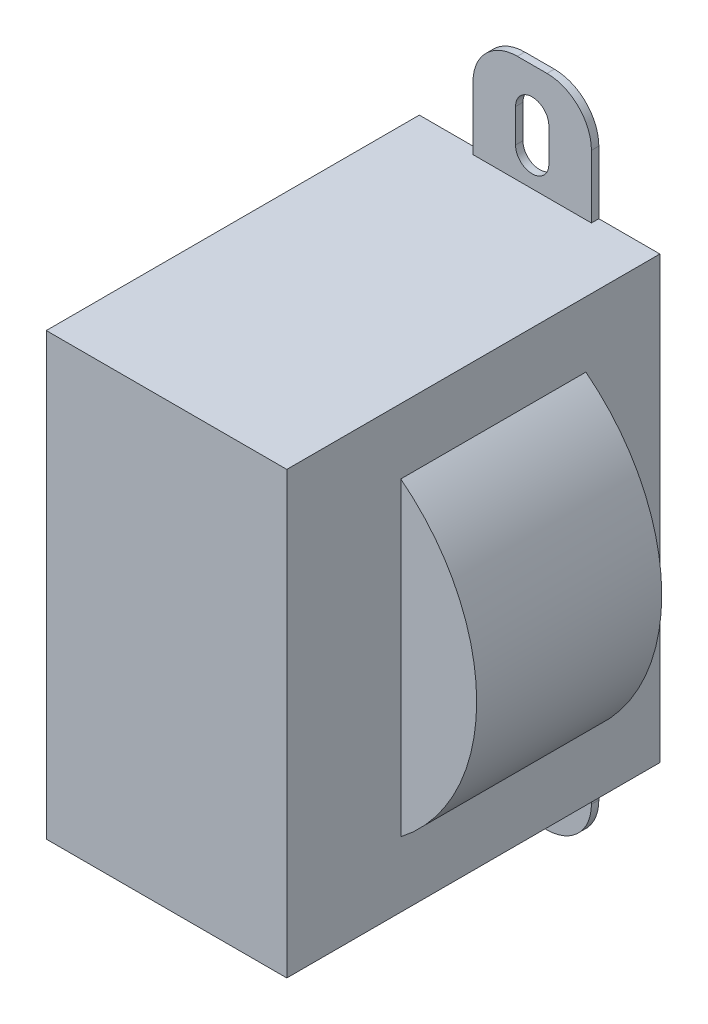
ISO-10303-21;
HEADER;
FILE_DESCRIPTION(('STEP AP214'),'2;1');
FILE_NAME('part.step','',(''),(''),'','','');
FILE_SCHEMA(('AUTOMOTIVE_DESIGN { 1 0 10303 214 1 1 1 1 }'));
ENDSEC;
DATA;
#1=APPLICATION_CONTEXT('core data for automotive mechanical design processes');
#2=APPLICATION_PROTOCOL_DEFINITION('international standard','automotive_design',2000,#1);
#3=PRODUCT_CONTEXT('',#1,'mechanical');
#4=PRODUCT('Part','Part','',(#3));
#5=PRODUCT_RELATED_PRODUCT_CATEGORY('part','',(#4));
#6=PRODUCT_DEFINITION_FORMATION('','',#4);
#7=PRODUCT_DEFINITION_CONTEXT('part definition',#1,'design');
#8=PRODUCT_DEFINITION('design','',#6,#7);
#9=PRODUCT_DEFINITION_SHAPE('','',#8);
#10=(LENGTH_UNIT() NAMED_UNIT(*) SI_UNIT(.MILLI.,.METRE.));
#11=(NAMED_UNIT(*) PLANE_ANGLE_UNIT() SI_UNIT($,.RADIAN.));
#12=(NAMED_UNIT(*) SI_UNIT($,.STERADIAN.) SOLID_ANGLE_UNIT());
#13=UNCERTAINTY_MEASURE_WITH_UNIT(LENGTH_MEASURE(1.E-05),#10,'distance_accuracy_value','');
#14=(GEOMETRIC_REPRESENTATION_CONTEXT(3) GLOBAL_UNCERTAINTY_ASSIGNED_CONTEXT((#13)) GLOBAL_UNIT_ASSIGNED_CONTEXT((#10,
#11,#12)) REPRESENTATION_CONTEXT('',''));
#15=CARTESIAN_POINT('',(0.,0.,0.));
#16=DIRECTION('',(0.,0.,1.));
#17=DIRECTION('',(1.,0.,0.));
#18=AXIS2_PLACEMENT_3D('',#15,#16,#17);
#19=CARTESIAN_POINT('',(-16.25,-29.75,42.4));
#20=DIRECTION('',(0.,1.,0.));
#21=DIRECTION('',(-1.,0.,0.));
#22=AXIS2_PLACEMENT_3D('',#19,#20,#21);
#23=PLANE('',#22);
#24=DIRECTION('',(0.,0.,-1.));
#25=VECTOR('',#24,1.);
#26=CARTESIAN_POINT('',(-7.99999999999999,-29.75,1.));
#27=LINE('',#26,#25);
#28=CARTESIAN_POINT('',(-7.99999999999999,-29.75,1.));
#29=VERTEX_POINT('',#28);
#30=CARTESIAN_POINT('',(-7.99999999999999,-29.75,0.));
#31=VERTEX_POINT('',#30);
#32=EDGE_CURVE('E325',#29,#31,#27,.T.);
#33=ORIENTED_EDGE('',*,*,#32,.F.);
#34=DIRECTION('',(-1.,0.,0.));
#35=VECTOR('',#34,1.);
#36=CARTESIAN_POINT('',(-7.99999999999999,-29.75,1.));
#37=LINE('',#36,#35);
#38=CARTESIAN_POINT('',(7.99999999999999,-29.75,1.));
#39=VERTEX_POINT('',#38);
#40=EDGE_CURVE('E308',#39,#29,#37,.T.);
#41=ORIENTED_EDGE('',*,*,#40,.F.);
#42=DIRECTION('',(0.,0.,-1.));
#43=VECTOR('',#42,1.);
#44=CARTESIAN_POINT('',(7.99999999999999,-29.75,1.));
#45=LINE('',#44,#43);
#46=CARTESIAN_POINT('',(8.,-29.75,0.));
#47=VERTEX_POINT('',#46);
#48=EDGE_CURVE('E331',#39,#47,#45,.T.);
#49=ORIENTED_EDGE('',*,*,#48,.T.);
#50=DIRECTION('',(1.,0.,0.));
#51=VECTOR('',#50,1.);
#52=CARTESIAN_POINT('',(-16.25,-29.75,0.));
#53=LINE('',#52,#51);
#54=CARTESIAN_POINT('',(16.25,-29.75,0.));
#55=VERTEX_POINT('',#54);
#56=EDGE_CURVE('E334',#47,#55,#53,.T.);
#57=ORIENTED_EDGE('',*,*,#56,.T.);
#58=DIRECTION('',(0.,0.,-1.));
#59=VECTOR('',#58,1.);
#60=CARTESIAN_POINT('',(16.25,-29.75,42.4));
#61=LINE('',#60,#59);
#62=CARTESIAN_POINT('',(16.25,-29.7500000000001,50.4));
#63=VERTEX_POINT('',#62);
#64=EDGE_CURVE('E357',#63,#55,#61,.T.);
#65=ORIENTED_EDGE('',*,*,#64,.F.);
#66=DIRECTION('',(1.,0.,0.));
#67=VECTOR('',#66,1.);
#68=CARTESIAN_POINT('',(16.25,-29.7500000000001,50.4));
#69=LINE('',#68,#67);
#70=CARTESIAN_POINT('',(-16.2432430182236,-29.75,50.4));
#71=VERTEX_POINT('',#70);
#72=EDGE_CURVE('E248',#71,#63,#69,.T.);
#73=ORIENTED_EDGE('',*,*,#72,.F.);
#74=DIRECTION('',(0.,0.,-1.));
#75=VECTOR('',#74,1.);
#76=CARTESIAN_POINT('',(-16.2432430182236,-29.75,50.4));
#77=LINE('',#76,#75);
#78=CARTESIAN_POINT('',(-16.2432430182236,-29.75,42.4));
#79=VERTEX_POINT('',#78);
#80=EDGE_CURVE('E240',#71,#79,#77,.T.);
#81=ORIENTED_EDGE('',*,*,#80,.T.);
#82=DIRECTION('',(1.,0.,0.));
#83=VECTOR('',#82,1.);
#84=CARTESIAN_POINT('',(-16.25,-29.75,42.4));
#85=LINE('',#84,#83);
#86=CARTESIAN_POINT('',(-16.25,-29.75,42.4));
#87=VERTEX_POINT('',#86);
#88=EDGE_CURVE('E225',#87,#79,#85,.T.);
#89=ORIENTED_EDGE('',*,*,#88,.F.);
#90=DIRECTION('',(0.,0.,-1.));
#91=VECTOR('',#90,1.);
#92=CARTESIAN_POINT('',(-16.25,-29.75,42.4));
#93=LINE('',#92,#91);
#94=CARTESIAN_POINT('',(-16.25,-29.75,0.));
#95=VERTEX_POINT('',#94);
#96=EDGE_CURVE('E360',#87,#95,#93,.T.);
#97=ORIENTED_EDGE('',*,*,#96,.T.);
#98=EDGE_CURVE('E373',#95,#31,#53,.T.);
#99=ORIENTED_EDGE('',*,*,#98,.T.);
#100=EDGE_LOOP('',(#33,#41,#49,#57,#65,#73,#81,#89,#97,#99));
#101=FACE_BOUND('',#100,.T.);
#102=ADVANCED_FACE('F28',(#101),#23,.F.);
#103=CARTESIAN_POINT('',(-16.25,29.75,42.4));
#104=DIRECTION('',(0.,-1.,0.));
#105=DIRECTION('',(1.,0.,0.));
#106=AXIS2_PLACEMENT_3D('',#103,#104,#105);
#107=PLANE('',#106);
#108=DIRECTION('',(0.,0.,-1.));
#109=VECTOR('',#108,1.);
#110=CARTESIAN_POINT('',(7.99999999999999,29.75,1.));
#111=LINE('',#110,#109);
#112=CARTESIAN_POINT('',(7.99999999999999,29.75,1.));
#113=VERTEX_POINT('',#112);
#114=CARTESIAN_POINT('',(7.99999999999999,29.75,0.));
#115=VERTEX_POINT('',#114);
#116=EDGE_CURVE('E390',#113,#115,#111,.T.);
#117=ORIENTED_EDGE('',*,*,#116,.F.);
#118=DIRECTION('',(1.,0.,0.));
#119=VECTOR('',#118,1.);
#120=CARTESIAN_POINT('',(-7.99999999999999,29.75,1.));
#121=LINE('',#120,#119);
#122=CARTESIAN_POINT('',(-7.99999999999999,29.75,1.));
#123=VERTEX_POINT('',#122);
#124=EDGE_CURVE('E393',#123,#113,#121,.T.);
#125=ORIENTED_EDGE('',*,*,#124,.F.);
#126=DIRECTION('',(0.,0.,-1.));
#127=VECTOR('',#126,1.);
#128=CARTESIAN_POINT('',(-7.99999999999999,29.75,1.));
#129=LINE('',#128,#127);
#130=CARTESIAN_POINT('',(-7.99999999999999,29.75,0.));
#131=VERTEX_POINT('',#130);
#132=EDGE_CURVE('E392',#123,#131,#129,.T.);
#133=ORIENTED_EDGE('',*,*,#132,.T.);
#134=DIRECTION('',(-1.,0.,0.));
#135=VECTOR('',#134,1.);
#136=CARTESIAN_POINT('',(-16.25,29.75,0.));
#137=LINE('',#136,#135);
#138=CARTESIAN_POINT('',(-16.25,29.75,0.));
#139=VERTEX_POINT('',#138);
#140=EDGE_CURVE('E367',#131,#139,#137,.T.);
#141=ORIENTED_EDGE('',*,*,#140,.T.);
#142=DIRECTION('',(0.,0.,-1.));
#143=VECTOR('',#142,1.);
#144=CARTESIAN_POINT('',(-16.25,29.75,42.4));
#145=LINE('',#144,#143);
#146=CARTESIAN_POINT('',(-16.25,29.75,42.4));
#147=VERTEX_POINT('',#146);
#148=EDGE_CURVE('E351',#147,#139,#145,.T.);
#149=ORIENTED_EDGE('',*,*,#148,.F.);
#150=DIRECTION('',(-1.,0.,0.));
#151=VECTOR('',#150,1.);
#152=CARTESIAN_POINT('',(-16.25,29.75,42.4));
#153=LINE('',#152,#151);
#154=CARTESIAN_POINT('',(-16.2432430182236,29.75,42.4));
#155=VERTEX_POINT('',#154);
#156=EDGE_CURVE('E233',#155,#147,#153,.T.);
#157=ORIENTED_EDGE('',*,*,#156,.F.);
#158=DIRECTION('',(0.,0.,-1.));
#159=VECTOR('',#158,1.);
#160=CARTESIAN_POINT('',(-16.2432430182236,29.7500000000001,50.4));
#161=LINE('',#160,#159);
#162=CARTESIAN_POINT('',(-16.2432430182236,29.7500000000001,50.4));
#163=VERTEX_POINT('',#162);
#164=EDGE_CURVE('E243',#163,#155,#161,.T.);
#165=ORIENTED_EDGE('',*,*,#164,.F.);
#166=DIRECTION('',(-1.,0.,0.));
#167=VECTOR('',#166,1.);
#168=CARTESIAN_POINT('',(16.25,29.7500000000001,50.4));
#169=LINE('',#168,#167);
#170=CARTESIAN_POINT('',(16.25,29.7500000000001,50.4));
#171=VERTEX_POINT('',#170);
#172=EDGE_CURVE('E262',#171,#163,#169,.T.);
#173=ORIENTED_EDGE('',*,*,#172,.F.);
#174=DIRECTION('',(0.,0.,-1.));
#175=VECTOR('',#174,1.);
#176=CARTESIAN_POINT('',(16.25,29.75,42.4));
#177=LINE('',#176,#175);
#178=CARTESIAN_POINT('',(16.25,29.75,0.));
#179=VERTEX_POINT('',#178);
#180=EDGE_CURVE('E354',#171,#179,#177,.T.);
#181=ORIENTED_EDGE('',*,*,#180,.T.);
#182=EDGE_CURVE('E364',#179,#115,#137,.T.);
#183=ORIENTED_EDGE('',*,*,#182,.T.);
#184=EDGE_LOOP('',(#117,#125,#133,#141,#149,#157,#165,#173,#181,#183));
#185=FACE_BOUND('',#184,.T.);
#186=ADVANCED_FACE('F460',(#185),#107,.F.);
#187=CARTESIAN_POINT('',(-16.25,29.75,42.4));
#188=DIRECTION('',(1.,0.,0.));
#189=DIRECTION('',(0.,1.,0.));
#190=AXIS2_PLACEMENT_3D('',#187,#188,#189);
#191=PLANE('',#190);
#192=DIRECTION('',(0.,0.,-1.));
#193=VECTOR('',#192,1.);
#194=CARTESIAN_POINT('',(-16.25,20.9329286054293,35.));
#195=LINE('',#194,#193);
#196=CARTESIAN_POINT('',(-16.25,20.9329286054293,35.));
#197=VERTEX_POINT('',#196);
#198=CARTESIAN_POINT('',(-16.25,20.9329286054293,10.));
#199=VERTEX_POINT('',#198);
#200=EDGE_CURVE('E429',#197,#199,#195,.T.);
#201=ORIENTED_EDGE('',*,*,#200,.F.);
#202=DIRECTION('',(0.,-1.,0.));
#203=VECTOR('',#202,1.);
#204=CARTESIAN_POINT('',(-16.25,29.75,35.));
#205=LINE('',#204,#203);
#206=CARTESIAN_POINT('',(-16.25,-20.9329286054293,35.));
#207=VERTEX_POINT('',#206);
#208=EDGE_CURVE('E441',#197,#207,#205,.T.);
#209=ORIENTED_EDGE('',*,*,#208,.T.);
#210=DIRECTION('',(0.,0.,-1.));
#211=VECTOR('',#210,1.);
#212=CARTESIAN_POINT('',(-16.25,-20.9329286054293,35.));
#213=LINE('',#212,#211);
#214=CARTESIAN_POINT('',(-16.25,-20.9329286054293,10.));
#215=VERTEX_POINT('',#214);
#216=EDGE_CURVE('E437',#207,#215,#213,.T.);
#217=ORIENTED_EDGE('',*,*,#216,.T.);
#218=DIRECTION('',(0.,-1.,0.));
#219=VECTOR('',#218,1.);
#220=CARTESIAN_POINT('',(-16.25,29.75,10.));
#221=LINE('',#220,#219);
#222=EDGE_CURVE('E439',#199,#215,#221,.T.);
#223=ORIENTED_EDGE('',*,*,#222,.F.);
#224=EDGE_LOOP('',(#201,#209,#217,#223));
#225=FACE_BOUND('',#224,.T.);
#226=DIRECTION('',(0.,-1.,0.));
#227=VECTOR('',#226,1.);
#228=CARTESIAN_POINT('',(-16.25,29.75,0.));
#229=LINE('',#228,#227);
#230=EDGE_CURVE('E376',#139,#95,#229,.T.);
#231=ORIENTED_EDGE('',*,*,#230,.T.);
#232=ORIENTED_EDGE('',*,*,#96,.F.);
#233=DIRECTION('',(0.,-1.,0.));
#234=VECTOR('',#233,1.);
#235=CARTESIAN_POINT('',(-16.25,29.75,42.4));
#236=LINE('',#235,#234);
#237=EDGE_CURVE('E228',#147,#87,#236,.T.);
#238=ORIENTED_EDGE('',*,*,#237,.F.);
#239=ORIENTED_EDGE('',*,*,#148,.T.);
#240=EDGE_LOOP('',(#231,#232,#238,#239));
#241=FACE_BOUND('',#240,.T.);
#242=ADVANCED_FACE('F30',(#225,#241),#191,.F.);
#243=CARTESIAN_POINT('',(16.25,29.75,42.4));
#244=DIRECTION('',(-1.,0.,0.));
#245=DIRECTION('',(0.,-1.,0.));
#246=AXIS2_PLACEMENT_3D('',#243,#244,#245);
#247=PLANE('',#246);
#248=DIRECTION('',(0.,0.,-1.));
#249=VECTOR('',#248,1.);
#250=CARTESIAN_POINT('',(16.25,-20.9329286054293,35.));
#251=LINE('',#250,#249);
#252=CARTESIAN_POINT('',(16.25,-20.9329286054293,35.));
#253=VERTEX_POINT('',#252);
#254=CARTESIAN_POINT('',(16.25,-20.9329286054293,10.));
#255=VERTEX_POINT('',#254);
#256=EDGE_CURVE('E434',#253,#255,#251,.T.);
#257=ORIENTED_EDGE('',*,*,#256,.F.);
#258=DIRECTION('',(0.,1.,0.));
#259=VECTOR('',#258,1.);
#260=CARTESIAN_POINT('',(16.25,29.75,35.));
#261=LINE('',#260,#259);
#262=CARTESIAN_POINT('',(16.25,20.9329286054293,35.));
#263=VERTEX_POINT('',#262);
#264=EDGE_CURVE('E11',#253,#263,#261,.T.);
#265=ORIENTED_EDGE('',*,*,#264,.T.);
#266=DIRECTION('',(0.,0.,-1.));
#267=VECTOR('',#266,1.);
#268=CARTESIAN_POINT('',(16.25,20.9329286054293,35.));
#269=LINE('',#268,#267);
#270=CARTESIAN_POINT('',(16.25,20.9329286054293,10.));
#271=VERTEX_POINT('',#270);
#272=EDGE_CURVE('E432',#263,#271,#269,.T.);
#273=ORIENTED_EDGE('',*,*,#272,.T.);
#274=DIRECTION('',(0.,1.,0.));
#275=VECTOR('',#274,1.);
#276=CARTESIAN_POINT('',(16.25,29.75,10.));
#277=LINE('',#276,#275);
#278=EDGE_CURVE('E37',#255,#271,#277,.T.);
#279=ORIENTED_EDGE('',*,*,#278,.F.);
#280=EDGE_LOOP('',(#257,#265,#273,#279));
#281=FACE_BOUND('',#280,.T.);
#282=DIRECTION('',(0.,1.,0.));
#283=VECTOR('',#282,1.);
#284=CARTESIAN_POINT('',(16.25,29.75,0.));
#285=LINE('',#284,#283);
#286=EDGE_CURVE('E371',#55,#179,#285,.T.);
#287=ORIENTED_EDGE('',*,*,#286,.T.);
#288=ORIENTED_EDGE('',*,*,#180,.F.);
#289=DIRECTION('',(0.,1.,0.));
#290=VECTOR('',#289,1.);
#291=CARTESIAN_POINT('',(16.25,29.7500000000001,50.4));
#292=LINE('',#291,#290);
#293=EDGE_CURVE('E244',#63,#171,#292,.T.);
#294=ORIENTED_EDGE('',*,*,#293,.F.);
#295=ORIENTED_EDGE('',*,*,#64,.T.);
#296=EDGE_LOOP('',(#287,#288,#294,#295));
#297=FACE_BOUND('',#296,.T.);
#298=ADVANCED_FACE('F453',(#281,#297),#247,.F.);
#299=CARTESIAN_POINT('',(-16.25,-29.75,42.4));
#300=DIRECTION('',(0.,0.,1.));
#301=DIRECTION('',(1.,0.,0.));
#302=AXIS2_PLACEMENT_3D('',#299,#300,#301);
#303=PLANE('',#302);
#304=DIRECTION('',(0.,-1.,0.));
#305=VECTOR('',#304,1.);
#306=CARTESIAN_POINT('',(-16.2432430182236,29.7500000000001,42.4));
#307=LINE('',#306,#305);
#308=EDGE_CURVE('E45',#155,#79,#307,.T.);
#309=ORIENTED_EDGE('',*,*,#308,.F.);
#310=ORIENTED_EDGE('',*,*,#156,.T.);
#311=ORIENTED_EDGE('',*,*,#237,.T.);
#312=ORIENTED_EDGE('',*,*,#88,.T.);
#313=EDGE_LOOP('',(#309,#310,#311,#312));
#314=FACE_BOUND('',#313,.T.);
#315=ADVANCED_FACE('F226',(#314),#303,.T.);
#316=CARTESIAN_POINT('',(-16.25,-29.75,0.));
#317=DIRECTION('',(0.,0.,1.));
#318=DIRECTION('',(1.,0.,0.));
#319=AXIS2_PLACEMENT_3D('',#316,#317,#318);
#320=PLANE('',#319);
#321=ORIENTED_EDGE('',*,*,#230,.F.);
#322=ORIENTED_EDGE('',*,*,#140,.F.);
#323=DIRECTION('',(0.,-1.,0.));
#324=VECTOR('',#323,1.);
#325=CARTESIAN_POINT('',(-8.,38.25,0.));
#326=LINE('',#325,#324);
#327=CARTESIAN_POINT('',(-8.,38.25,0.));
#328=VERTEX_POINT('',#327);
#329=EDGE_CURVE('E396',#328,#131,#326,.T.);
#330=ORIENTED_EDGE('',*,*,#329,.F.);
#331=CARTESIAN_POINT('',(-2.,38.25,0.));
#332=DIRECTION('',(0.,0.,1.));
#333=DIRECTION('',(-1.,0.,0.));
#334=AXIS2_PLACEMENT_3D('',#331,#332,#333);
#335=CIRCLE('',#334,6.);
#336=CARTESIAN_POINT('',(-1.99999999999996,44.25,0.));
#337=VERTEX_POINT('',#336);
#338=EDGE_CURVE('E398',#337,#328,#335,.T.);
#339=ORIENTED_EDGE('',*,*,#338,.F.);
#340=DIRECTION('',(-1.,0.,0.));
#341=VECTOR('',#340,1.);
#342=CARTESIAN_POINT('',(-1.99999999999996,44.25,0.));
#343=LINE('',#342,#341);
#344=CARTESIAN_POINT('',(1.99999999999999,44.25,0.));
#345=VERTEX_POINT('',#344);
#346=EDGE_CURVE('E783',#345,#337,#343,.T.);
#347=ORIENTED_EDGE('',*,*,#346,.F.);
#348=CARTESIAN_POINT('',(1.99999999999999,38.25,0.));
#349=DIRECTION('',(0.,0.,1.));
#350=DIRECTION('',(1.,0.,0.));
#351=AXIS2_PLACEMENT_3D('',#348,#349,#350);
#352=CIRCLE('',#351,6.);
#353=CARTESIAN_POINT('',(7.99999999999999,38.25,0.));
#354=VERTEX_POINT('',#353);
#355=EDGE_CURVE('E386',#354,#345,#352,.T.);
#356=ORIENTED_EDGE('',*,*,#355,.F.);
#357=DIRECTION('',(0.,1.,0.));
#358=VECTOR('',#357,1.);
#359=CARTESIAN_POINT('',(8.,38.25,0.));
#360=LINE('',#359,#358);
#361=EDGE_CURVE('E383',#115,#354,#360,.T.);
#362=ORIENTED_EDGE('',*,*,#361,.F.);
#363=ORIENTED_EDGE('',*,*,#182,.F.);
#364=ORIENTED_EDGE('',*,*,#286,.F.);
#365=ORIENTED_EDGE('',*,*,#56,.F.);
#366=DIRECTION('',(0.,1.,0.));
#367=VECTOR('',#366,1.);
#368=CARTESIAN_POINT('',(8.,-38.25,0.));
#369=LINE('',#368,#367);
#370=CARTESIAN_POINT('',(8.,-38.25,0.));
#371=VERTEX_POINT('',#370);
#372=EDGE_CURVE('E53',#371,#47,#369,.T.);
#373=ORIENTED_EDGE('',*,*,#372,.F.);
#374=CARTESIAN_POINT('',(1.99999999999999,-38.25,0.));
#375=DIRECTION('',(0.,0.,1.));
#376=DIRECTION('',(-1.,0.,0.));
#377=AXIS2_PLACEMENT_3D('',#374,#375,#376);
#378=CIRCLE('',#377,6.);
#379=CARTESIAN_POINT('',(1.99999999999999,-44.25,0.));
#380=VERTEX_POINT('',#379);
#381=EDGE_CURVE('E295',#380,#371,#378,.T.);
#382=ORIENTED_EDGE('',*,*,#381,.F.);
#383=DIRECTION('',(1.,0.,0.));
#384=VECTOR('',#383,1.);
#385=CARTESIAN_POINT('',(-1.99999999999996,-44.25,0.));
#386=LINE('',#385,#384);
#387=CARTESIAN_POINT('',(-1.99999999999996,-44.25,0.));
#388=VERTEX_POINT('',#387);
#389=EDGE_CURVE('E300',#388,#380,#386,.T.);
#390=ORIENTED_EDGE('',*,*,#389,.F.);
#391=CARTESIAN_POINT('',(-2.,-38.25,0.));
#392=DIRECTION('',(0.,0.,1.));
#393=DIRECTION('',(1.,0.,0.));
#394=AXIS2_PLACEMENT_3D('',#391,#392,#393);
#395=CIRCLE('',#394,6.);
#396=CARTESIAN_POINT('',(-8.,-38.25,0.));
#397=VERTEX_POINT('',#396);
#398=EDGE_CURVE('E298',#397,#388,#395,.T.);
#399=ORIENTED_EDGE('',*,*,#398,.F.);
#400=DIRECTION('',(0.,-1.,0.));
#401=VECTOR('',#400,1.);
#402=CARTESIAN_POINT('',(-8.,-38.25,0.));
#403=LINE('',#402,#401);
#404=EDGE_CURVE('E301',#31,#397,#403,.T.);
#405=ORIENTED_EDGE('',*,*,#404,.F.);
#406=ORIENTED_EDGE('',*,*,#98,.F.);
#407=EDGE_LOOP('',(#321,#322,#330,#339,#347,#356,#362,#363,#364,#365,#373,#382,#390,#399,#405,#406));
#408=FACE_BOUND('',#407,.T.);
#409=DIRECTION('',(0.,1.,0.));
#410=VECTOR('',#409,1.);
#411=CARTESIAN_POINT('',(2.25,38.25,0.));
#412=LINE('',#411,#410);
#413=CARTESIAN_POINT('',(2.25,33.75,0.));
#414=VERTEX_POINT('',#413);
#415=CARTESIAN_POINT('',(2.25,38.25,0.));
#416=VERTEX_POINT('',#415);
#417=EDGE_CURVE('E762',#414,#416,#412,.T.);
#418=ORIENTED_EDGE('',*,*,#417,.T.);
#419=CARTESIAN_POINT('',(0.,38.25,0.));
#420=DIRECTION('',(0.,0.,1.));
#421=DIRECTION('',(1.,0.,0.));
#422=AXIS2_PLACEMENT_3D('',#419,#420,#421);
#423=CIRCLE('',#422,2.25);
#424=CARTESIAN_POINT('',(-2.25,38.25,0.));
#425=VERTEX_POINT('',#424);
#426=EDGE_CURVE('E752',#416,#425,#423,.T.);
#427=ORIENTED_EDGE('',*,*,#426,.T.);
#428=DIRECTION('',(0.,-1.,0.));
#429=VECTOR('',#428,1.);
#430=CARTESIAN_POINT('',(-2.25,38.25,0.));
#431=LINE('',#430,#429);
#432=CARTESIAN_POINT('',(-2.25,33.75,0.));
#433=VERTEX_POINT('',#432);
#434=EDGE_CURVE('E754',#425,#433,#431,.T.);
#435=ORIENTED_EDGE('',*,*,#434,.T.);
#436=CARTESIAN_POINT('',(0.,33.75,0.));
#437=DIRECTION('',(0.,0.,1.));
#438=DIRECTION('',(1.,0.,0.));
#439=AXIS2_PLACEMENT_3D('',#436,#437,#438);
#440=CIRCLE('',#439,2.25);
#441=EDGE_CURVE('E757',#433,#414,#440,.T.);
#442=ORIENTED_EDGE('',*,*,#441,.T.);
#443=EDGE_LOOP('',(#418,#427,#435,#442));
#444=FACE_BOUND('',#443,.T.);
#445=DIRECTION('',(0.,-1.,0.));
#446=VECTOR('',#445,1.);
#447=CARTESIAN_POINT('',(-2.25,-38.25,0.));
#448=LINE('',#447,#446);
#449=CARTESIAN_POINT('',(-2.24999999999999,-33.75,0.));
#450=VERTEX_POINT('',#449);
#451=CARTESIAN_POINT('',(-2.25,-38.25,0.));
#452=VERTEX_POINT('',#451);
#453=EDGE_CURVE('E273',#450,#452,#448,.T.);
#454=ORIENTED_EDGE('',*,*,#453,.T.);
#455=CARTESIAN_POINT('',(0.,-38.25,0.));
#456=DIRECTION('',(0.,0.,1.));
#457=DIRECTION('',(-1.,0.,0.));
#458=AXIS2_PLACEMENT_3D('',#455,#456,#457);
#459=CIRCLE('',#458,2.25);
#460=CARTESIAN_POINT('',(2.25,-38.25,0.));
#461=VERTEX_POINT('',#460);
#462=EDGE_CURVE('E250',#452,#461,#459,.T.);
#463=ORIENTED_EDGE('',*,*,#462,.T.);
#464=DIRECTION('',(0.,1.,0.));
#465=VECTOR('',#464,1.);
#466=CARTESIAN_POINT('',(2.25,-38.25,0.));
#467=LINE('',#466,#465);
#468=CARTESIAN_POINT('',(2.25,-33.75,0.));
#469=VERTEX_POINT('',#468);
#470=EDGE_CURVE('E267',#461,#469,#467,.T.);
#471=ORIENTED_EDGE('',*,*,#470,.T.);
#472=CARTESIAN_POINT('',(0.,-33.75,0.));
#473=DIRECTION('',(0.,0.,1.));
#474=DIRECTION('',(-1.,0.,0.));
#475=AXIS2_PLACEMENT_3D('',#472,#473,#474);
#476=CIRCLE('',#475,2.25);
#477=EDGE_CURVE('E270',#469,#450,#476,.T.);
#478=ORIENTED_EDGE('',*,*,#477,.T.);
#479=EDGE_LOOP('',(#454,#463,#471,#478));
#480=FACE_BOUND('',#479,.T.);
#481=ADVANCED_FACE('F455',(#408,#444,#480),#320,.F.);
#482=CARTESIAN_POINT('',(0.,0.,35.));
#483=DIRECTION('',(0.,0.,1.));
#484=DIRECTION('',(1.,0.,0.));
#485=AXIS2_PLACEMENT_3D('',#482,#483,#484);
#486=PLANE('',#485);
#487=ORIENTED_EDGE('',*,*,#264,.F.);
#488=CARTESIAN_POINT('',(0.,0.,35.));
#489=DIRECTION('',(0.,0.,1.));
#490=DIRECTION('',(1.,0.,0.));
#491=AXIS2_PLACEMENT_3D('',#488,#489,#490);
#492=CIRCLE('',#491,26.5);
#493=EDGE_CURVE('E426',#253,#263,#492,.T.);
#494=ORIENTED_EDGE('',*,*,#493,.T.);
#495=EDGE_LOOP('',(#487,#494));
#496=FACE_BOUND('',#495,.T.);
#497=ADVANCED_FACE('F486',(#496),#486,.T.);
#498=CARTESIAN_POINT('',(0.,0.,10.));
#499=DIRECTION('',(0.,0.,1.));
#500=DIRECTION('',(1.,0.,0.));
#501=AXIS2_PLACEMENT_3D('',#498,#499,#500);
#502=PLANE('',#501);
#503=CARTESIAN_POINT('',(0.,0.,10.));
#504=DIRECTION('',(0.,0.,1.));
#505=DIRECTION('',(1.,0.,0.));
#506=AXIS2_PLACEMENT_3D('',#503,#504,#505);
#507=CIRCLE('',#506,26.5);
#508=EDGE_CURVE('E420',#255,#271,#507,.T.);
#509=ORIENTED_EDGE('',*,*,#508,.F.);
#510=ORIENTED_EDGE('',*,*,#278,.T.);
#511=EDGE_LOOP('',(#509,#510));
#512=FACE_BOUND('',#511,.T.);
#513=ADVANCED_FACE('F497',(#512),#502,.F.);
#514=CARTESIAN_POINT('',(0.,0.,35.));
#515=DIRECTION('',(0.,0.,-1.));
#516=DIRECTION('',(-1.,0.,0.));
#517=AXIS2_PLACEMENT_3D('',#514,#515,#516);
#518=CYLINDRICAL_SURFACE('',#517,26.5);
#519=ORIENTED_EDGE('',*,*,#508,.T.);
#520=ORIENTED_EDGE('',*,*,#272,.F.);
#521=ORIENTED_EDGE('',*,*,#493,.F.);
#522=ORIENTED_EDGE('',*,*,#256,.T.);
#523=EDGE_LOOP('',(#519,#520,#521,#522));
#524=FACE_BOUND('',#523,.T.);
#525=ADVANCED_FACE('F493',(#524),#518,.T.);
#526=ORIENTED_EDGE('',*,*,#208,.F.);
#527=CARTESIAN_POINT('',(0.,0.,35.));
#528=DIRECTION('',(0.,0.,1.));
#529=DIRECTION('',(1.,0.,0.));
#530=AXIS2_PLACEMENT_3D('',#527,#528,#529);
#531=CIRCLE('',#530,26.5);
#532=EDGE_CURVE('E423',#197,#207,#531,.T.);
#533=ORIENTED_EDGE('',*,*,#532,.T.);
#534=EDGE_LOOP('',(#526,#533));
#535=FACE_BOUND('',#534,.T.);
#536=ADVANCED_FACE('F496',(#535),#486,.T.);
#537=CARTESIAN_POINT('',(0.,0.,10.));
#538=DIRECTION('',(0.,0.,1.));
#539=DIRECTION('',(1.,0.,0.));
#540=AXIS2_PLACEMENT_3D('',#537,#538,#539);
#541=CIRCLE('',#540,26.5);
#542=EDGE_CURVE('E417',#199,#215,#541,.T.);
#543=ORIENTED_EDGE('',*,*,#542,.F.);
#544=ORIENTED_EDGE('',*,*,#222,.T.);
#545=EDGE_LOOP('',(#543,#544));
#546=FACE_BOUND('',#545,.T.);
#547=ADVANCED_FACE('F491',(#546),#502,.F.);
#548=CARTESIAN_POINT('',(0.,0.,35.));
#549=DIRECTION('',(0.,0.,-1.));
#550=DIRECTION('',(-1.,0.,0.));
#551=AXIS2_PLACEMENT_3D('',#548,#549,#550);
#552=CYLINDRICAL_SURFACE('',#551,26.5);
#553=ORIENTED_EDGE('',*,*,#542,.T.);
#554=ORIENTED_EDGE('',*,*,#216,.F.);
#555=ORIENTED_EDGE('',*,*,#532,.F.);
#556=ORIENTED_EDGE('',*,*,#200,.T.);
#557=EDGE_LOOP('',(#553,#554,#555,#556));
#558=FACE_BOUND('',#557,.T.);
#559=ADVANCED_FACE('F487',(#558),#552,.T.);
#560=CARTESIAN_POINT('',(-2.,38.25,1.));
#561=DIRECTION('',(0.,0.,-1.));
#562=DIRECTION('',(-1.,0.,0.));
#563=AXIS2_PLACEMENT_3D('',#560,#561,#562);
#564=PLANE('',#563);
#565=DIRECTION('',(0.,1.,0.));
#566=VECTOR('',#565,1.);
#567=CARTESIAN_POINT('',(8.,38.25,1.));
#568=LINE('',#567,#566);
#569=CARTESIAN_POINT('',(7.99999999999999,38.25,1.));
#570=VERTEX_POINT('',#569);
#571=EDGE_CURVE('E397',#113,#570,#568,.T.);
#572=ORIENTED_EDGE('',*,*,#571,.T.);
#573=CARTESIAN_POINT('',(1.99999999999999,38.25,1.));
#574=DIRECTION('',(0.,0.,1.));
#575=DIRECTION('',(1.,0.,0.));
#576=AXIS2_PLACEMENT_3D('',#573,#574,#575);
#577=CIRCLE('',#576,6.);
#578=CARTESIAN_POINT('',(1.99999999999999,44.25,1.));
#579=VERTEX_POINT('',#578);
#580=EDGE_CURVE('E788',#570,#579,#577,.T.);
#581=ORIENTED_EDGE('',*,*,#580,.T.);
#582=DIRECTION('',(-1.,0.,0.));
#583=VECTOR('',#582,1.);
#584=CARTESIAN_POINT('',(-1.99999999999996,44.25,1.));
#585=LINE('',#584,#583);
#586=CARTESIAN_POINT('',(-1.99999999999996,44.25,1.));
#587=VERTEX_POINT('',#586);
#588=EDGE_CURVE('E790',#579,#587,#585,.T.);
#589=ORIENTED_EDGE('',*,*,#588,.T.);
#590=CARTESIAN_POINT('',(-2.,38.25,1.));
#591=DIRECTION('',(0.,0.,1.));
#592=DIRECTION('',(-1.,0.,0.));
#593=AXIS2_PLACEMENT_3D('',#590,#591,#592);
#594=CIRCLE('',#593,6.);
#595=CARTESIAN_POINT('',(-8.,38.25,1.));
#596=VERTEX_POINT('',#595);
#597=EDGE_CURVE('E792',#587,#596,#594,.T.);
#598=ORIENTED_EDGE('',*,*,#597,.T.);
#599=DIRECTION('',(0.,-1.,0.));
#600=VECTOR('',#599,1.);
#601=CARTESIAN_POINT('',(-8.,38.25,1.));
#602=LINE('',#601,#600);
#603=EDGE_CURVE('E793',#596,#123,#602,.T.);
#604=ORIENTED_EDGE('',*,*,#603,.T.);
#605=ORIENTED_EDGE('',*,*,#124,.T.);
#606=EDGE_LOOP('',(#572,#581,#589,#598,#604,#605));
#607=FACE_BOUND('',#606,.T.);
#608=CARTESIAN_POINT('',(0.,38.25,1.));
#609=DIRECTION('',(0.,0.,1.));
#610=DIRECTION('',(1.,0.,0.));
#611=AXIS2_PLACEMENT_3D('',#608,#609,#610);
#612=CIRCLE('',#611,2.25);
#613=CARTESIAN_POINT('',(2.25,38.25,1.));
#614=VERTEX_POINT('',#613);
#615=CARTESIAN_POINT('',(-2.25,38.25,1.));
#616=VERTEX_POINT('',#615);
#617=EDGE_CURVE('E764',#614,#616,#612,.T.);
#618=ORIENTED_EDGE('',*,*,#617,.F.);
#619=DIRECTION('',(0.,1.,0.));
#620=VECTOR('',#619,1.);
#621=CARTESIAN_POINT('',(2.25,38.25,1.));
#622=LINE('',#621,#620);
#623=CARTESIAN_POINT('',(2.25,33.75,1.));
#624=VERTEX_POINT('',#623);
#625=EDGE_CURVE('E771',#624,#614,#622,.T.);
#626=ORIENTED_EDGE('',*,*,#625,.F.);
#627=CARTESIAN_POINT('',(0.,33.75,1.));
#628=DIRECTION('',(0.,0.,1.));
#629=DIRECTION('',(1.,0.,0.));
#630=AXIS2_PLACEMENT_3D('',#627,#628,#629);
#631=CIRCLE('',#630,2.25);
#632=CARTESIAN_POINT('',(-2.25,33.75,1.));
#633=VERTEX_POINT('',#632);
#634=EDGE_CURVE('E768',#633,#624,#631,.T.);
#635=ORIENTED_EDGE('',*,*,#634,.F.);
#636=DIRECTION('',(0.,-1.,0.));
#637=VECTOR('',#636,1.);
#638=CARTESIAN_POINT('',(-2.25,38.25,1.));
#639=LINE('',#638,#637);
#640=EDGE_CURVE('E766',#616,#633,#639,.T.);
#641=ORIENTED_EDGE('',*,*,#640,.F.);
#642=EDGE_LOOP('',(#618,#626,#635,#641));
#643=FACE_BOUND('',#642,.T.);
#644=ADVANCED_FACE('F490',(#607,#643),#564,.F.);
#645=CARTESIAN_POINT('',(8.,38.25,1.));
#646=DIRECTION('',(-1.,0.,0.));
#647=DIRECTION('',(0.,-1.,0.));
#648=AXIS2_PLACEMENT_3D('',#645,#646,#647);
#649=PLANE('',#648);
#650=ORIENTED_EDGE('',*,*,#361,.T.);
#651=DIRECTION('',(0.,0.,-1.));
#652=VECTOR('',#651,1.);
#653=CARTESIAN_POINT('',(7.99999999999999,38.25,1.));
#654=LINE('',#653,#652);
#655=EDGE_CURVE('E414',#570,#354,#654,.T.);
#656=ORIENTED_EDGE('',*,*,#655,.F.);
#657=ORIENTED_EDGE('',*,*,#571,.F.);
#658=ORIENTED_EDGE('',*,*,#116,.T.);
#659=EDGE_LOOP('',(#650,#656,#657,#658));
#660=FACE_BOUND('',#659,.T.);
#661=ADVANCED_FACE('F505',(#660),#649,.F.);
#662=CARTESIAN_POINT('',(1.99999999999999,38.25,1.));
#663=DIRECTION('',(0.,0.,-1.));
#664=DIRECTION('',(-1.,0.,0.));
#665=AXIS2_PLACEMENT_3D('',#662,#663,#664);
#666=CYLINDRICAL_SURFACE('',#665,6.);
#667=ORIENTED_EDGE('',*,*,#355,.T.);
#668=DIRECTION('',(0.,0.,-1.));
#669=VECTOR('',#668,1.);
#670=CARTESIAN_POINT('',(1.99999999999999,44.25,1.));
#671=LINE('',#670,#669);
#672=EDGE_CURVE('E411',#579,#345,#671,.T.);
#673=ORIENTED_EDGE('',*,*,#672,.F.);
#674=ORIENTED_EDGE('',*,*,#580,.F.);
#675=ORIENTED_EDGE('',*,*,#655,.T.);
#676=EDGE_LOOP('',(#667,#673,#674,#675));
#677=FACE_BOUND('',#676,.T.);
#678=ADVANCED_FACE('F508',(#677),#666,.T.);
#679=CARTESIAN_POINT('',(-1.99999999999996,44.25,1.));
#680=DIRECTION('',(0.,-1.,0.));
#681=DIRECTION('',(0.,0.,-1.));
#682=AXIS2_PLACEMENT_3D('',#679,#680,#681);
#683=PLANE('',#682);
#684=ORIENTED_EDGE('',*,*,#346,.T.);
#685=DIRECTION('',(0.,0.,-1.));
#686=VECTOR('',#685,1.);
#687=CARTESIAN_POINT('',(-1.99999999999996,44.25,1.));
#688=LINE('',#687,#686);
#689=EDGE_CURVE('E408',#587,#337,#688,.T.);
#690=ORIENTED_EDGE('',*,*,#689,.F.);
#691=ORIENTED_EDGE('',*,*,#588,.F.);
#692=ORIENTED_EDGE('',*,*,#672,.T.);
#693=EDGE_LOOP('',(#684,#690,#691,#692));
#694=FACE_BOUND('',#693,.T.);
#695=ADVANCED_FACE('F512',(#694),#683,.F.);
#696=CARTESIAN_POINT('',(-2.,38.25,1.));
#697=DIRECTION('',(0.,0.,-1.));
#698=DIRECTION('',(-1.,0.,0.));
#699=AXIS2_PLACEMENT_3D('',#696,#697,#698);
#700=CYLINDRICAL_SURFACE('',#699,6.);
#701=ORIENTED_EDGE('',*,*,#338,.T.);
#702=DIRECTION('',(0.,0.,-1.));
#703=VECTOR('',#702,1.);
#704=CARTESIAN_POINT('',(-8.,38.25,1.));
#705=LINE('',#704,#703);
#706=EDGE_CURVE('E401',#596,#328,#705,.T.);
#707=ORIENTED_EDGE('',*,*,#706,.F.);
#708=ORIENTED_EDGE('',*,*,#597,.F.);
#709=ORIENTED_EDGE('',*,*,#689,.T.);
#710=EDGE_LOOP('',(#701,#707,#708,#709));
#711=FACE_BOUND('',#710,.T.);
#712=ADVANCED_FACE('F516',(#711),#700,.T.);
#713=CARTESIAN_POINT('',(-8.,38.25,1.));
#714=DIRECTION('',(1.,0.,0.));
#715=DIRECTION('',(0.,1.,0.));
#716=AXIS2_PLACEMENT_3D('',#713,#714,#715);
#717=PLANE('',#716);
#718=ORIENTED_EDGE('',*,*,#329,.T.);
#719=ORIENTED_EDGE('',*,*,#132,.F.);
#720=ORIENTED_EDGE('',*,*,#603,.F.);
#721=ORIENTED_EDGE('',*,*,#706,.T.);
#722=EDGE_LOOP('',(#718,#719,#720,#721));
#723=FACE_BOUND('',#722,.T.);
#724=ADVANCED_FACE('F520',(#723),#717,.F.);
#725=CARTESIAN_POINT('',(0.,38.25,1.));
#726=DIRECTION('',(0.,0.,-1.));
#727=DIRECTION('',(-1.,0.,0.));
#728=AXIS2_PLACEMENT_3D('',#725,#726,#727);
#729=CYLINDRICAL_SURFACE('',#728,2.25);
#730=ORIENTED_EDGE('',*,*,#426,.F.);
#731=DIRECTION('',(0.,0.,-1.));
#732=VECTOR('',#731,1.);
#733=CARTESIAN_POINT('',(2.25,38.25,1.));
#734=LINE('',#733,#732);
#735=EDGE_CURVE('E773',#614,#416,#734,.T.);
#736=ORIENTED_EDGE('',*,*,#735,.F.);
#737=ORIENTED_EDGE('',*,*,#617,.T.);
#738=DIRECTION('',(0.,0.,-1.));
#739=VECTOR('',#738,1.);
#740=CARTESIAN_POINT('',(-2.25,38.25,1.));
#741=LINE('',#740,#739);
#742=EDGE_CURVE('E387',#616,#425,#741,.T.);
#743=ORIENTED_EDGE('',*,*,#742,.T.);
#744=EDGE_LOOP('',(#730,#736,#737,#743));
#745=FACE_BOUND('',#744,.T.);
#746=ADVANCED_FACE('F524',(#745),#729,.F.);
#747=CARTESIAN_POINT('',(-2.25,38.25,1.));
#748=DIRECTION('',(1.,0.,0.));
#749=DIRECTION('',(0.,1.,0.));
#750=AXIS2_PLACEMENT_3D('',#747,#748,#749);
#751=PLANE('',#750);
#752=ORIENTED_EDGE('',*,*,#434,.F.);
#753=ORIENTED_EDGE('',*,*,#742,.F.);
#754=ORIENTED_EDGE('',*,*,#640,.T.);
#755=DIRECTION('',(0.,0.,-1.));
#756=VECTOR('',#755,1.);
#757=CARTESIAN_POINT('',(-2.25,33.75,1.));
#758=LINE('',#757,#756);
#759=EDGE_CURVE('E778',#633,#433,#758,.T.);
#760=ORIENTED_EDGE('',*,*,#759,.T.);
#761=EDGE_LOOP('',(#752,#753,#754,#760));
#762=FACE_BOUND('',#761,.T.);
#763=ADVANCED_FACE('F531',(#762),#751,.T.);
#764=CARTESIAN_POINT('',(0.,33.75,1.));
#765=DIRECTION('',(0.,0.,-1.));
#766=DIRECTION('',(-1.,0.,0.));
#767=AXIS2_PLACEMENT_3D('',#764,#765,#766);
#768=CYLINDRICAL_SURFACE('',#767,2.25);
#769=ORIENTED_EDGE('',*,*,#441,.F.);
#770=ORIENTED_EDGE('',*,*,#759,.F.);
#771=ORIENTED_EDGE('',*,*,#634,.T.);
#772=DIRECTION('',(0.,0.,-1.));
#773=VECTOR('',#772,1.);
#774=CARTESIAN_POINT('',(2.25,33.75,1.));
#775=LINE('',#774,#773);
#776=EDGE_CURVE('E776',#624,#414,#775,.T.);
#777=ORIENTED_EDGE('',*,*,#776,.T.);
#778=EDGE_LOOP('',(#769,#770,#771,#777));
#779=FACE_BOUND('',#778,.T.);
#780=ADVANCED_FACE('F535',(#779),#768,.F.);
#781=CARTESIAN_POINT('',(2.25,38.25,1.));
#782=DIRECTION('',(-1.,0.,0.));
#783=DIRECTION('',(0.,-1.,0.));
#784=AXIS2_PLACEMENT_3D('',#781,#782,#783);
#785=PLANE('',#784);
#786=ORIENTED_EDGE('',*,*,#417,.F.);
#787=ORIENTED_EDGE('',*,*,#776,.F.);
#788=ORIENTED_EDGE('',*,*,#625,.T.);
#789=ORIENTED_EDGE('',*,*,#735,.T.);
#790=EDGE_LOOP('',(#786,#787,#788,#789));
#791=FACE_BOUND('',#790,.T.);
#792=ADVANCED_FACE('F539',(#791),#785,.T.);
#793=CARTESIAN_POINT('',(1.99999999999999,-38.25,1.));
#794=DIRECTION('',(0.,0.,-1.));
#795=DIRECTION('',(-1.,0.,0.));
#796=AXIS2_PLACEMENT_3D('',#793,#794,#795);
#797=PLANE('',#796);
#798=CARTESIAN_POINT('',(1.99999999999999,-38.25,1.));
#799=DIRECTION('',(0.,0.,1.));
#800=DIRECTION('',(-1.,0.,0.));
#801=AXIS2_PLACEMENT_3D('',#798,#799,#800);
#802=CIRCLE('',#801,6.);
#803=CARTESIAN_POINT('',(1.99999999999999,-44.25,1.));
#804=VERTEX_POINT('',#803);
#805=CARTESIAN_POINT('',(8.,-38.25,1.));
#806=VERTEX_POINT('',#805);
#807=EDGE_CURVE('E303',#804,#806,#802,.T.);
#808=ORIENTED_EDGE('',*,*,#807,.T.);
#809=DIRECTION('',(0.,1.,0.));
#810=VECTOR('',#809,1.);
#811=CARTESIAN_POINT('',(8.,-38.25,1.));
#812=LINE('',#811,#810);
#813=EDGE_CURVE('E306',#806,#39,#812,.T.);
#814=ORIENTED_EDGE('',*,*,#813,.T.);
#815=ORIENTED_EDGE('',*,*,#40,.T.);
#816=DIRECTION('',(0.,-1.,0.));
#817=VECTOR('',#816,1.);
#818=CARTESIAN_POINT('',(-8.,-38.25,1.));
#819=LINE('',#818,#817);
#820=CARTESIAN_POINT('',(-8.,-38.25,1.));
#821=VERTEX_POINT('',#820);
#822=EDGE_CURVE('E310',#29,#821,#819,.T.);
#823=ORIENTED_EDGE('',*,*,#822,.T.);
#824=CARTESIAN_POINT('',(-2.,-38.25,1.));
#825=DIRECTION('',(0.,0.,1.));
#826=DIRECTION('',(1.,0.,0.));
#827=AXIS2_PLACEMENT_3D('',#824,#825,#826);
#828=CIRCLE('',#827,6.);
#829=CARTESIAN_POINT('',(-1.99999999999996,-44.25,1.));
#830=VERTEX_POINT('',#829);
#831=EDGE_CURVE('E312',#821,#830,#828,.T.);
#832=ORIENTED_EDGE('',*,*,#831,.T.);
#833=DIRECTION('',(1.,0.,0.));
#834=VECTOR('',#833,1.);
#835=CARTESIAN_POINT('',(-1.99999999999996,-44.25,1.));
#836=LINE('',#835,#834);
#837=EDGE_CURVE('E314',#830,#804,#836,.T.);
#838=ORIENTED_EDGE('',*,*,#837,.T.);
#839=EDGE_LOOP('',(#808,#814,#815,#823,#832,#838));
#840=FACE_BOUND('',#839,.T.);
#841=CARTESIAN_POINT('',(0.,-38.25,1.));
#842=DIRECTION('',(0.,0.,1.));
#843=DIRECTION('',(-1.,0.,0.));
#844=AXIS2_PLACEMENT_3D('',#841,#842,#843);
#845=CIRCLE('',#844,2.25);
#846=CARTESIAN_POINT('',(-2.25,-38.25,1.));
#847=VERTEX_POINT('',#846);
#848=CARTESIAN_POINT('',(2.25,-38.25,1.));
#849=VERTEX_POINT('',#848);
#850=EDGE_CURVE('E276',#847,#849,#845,.T.);
#851=ORIENTED_EDGE('',*,*,#850,.F.);
#852=DIRECTION('',(0.,-1.,0.));
#853=VECTOR('',#852,1.);
#854=CARTESIAN_POINT('',(-2.25,-38.25,1.));
#855=LINE('',#854,#853);
#856=CARTESIAN_POINT('',(-2.25,-33.75,1.));
#857=VERTEX_POINT('',#856);
#858=EDGE_CURVE('E283',#857,#847,#855,.T.);
#859=ORIENTED_EDGE('',*,*,#858,.F.);
#860=CARTESIAN_POINT('',(0.,-33.75,1.));
#861=DIRECTION('',(0.,0.,1.));
#862=DIRECTION('',(-1.,0.,0.));
#863=AXIS2_PLACEMENT_3D('',#860,#861,#862);
#864=CIRCLE('',#863,2.25);
#865=CARTESIAN_POINT('',(2.25,-33.75,1.));
#866=VERTEX_POINT('',#865);
#867=EDGE_CURVE('E280',#866,#857,#864,.T.);
#868=ORIENTED_EDGE('',*,*,#867,.F.);
#869=DIRECTION('',(0.,1.,0.));
#870=VECTOR('',#869,1.);
#871=CARTESIAN_POINT('',(2.25,-38.25,1.));
#872=LINE('',#871,#870);
#873=EDGE_CURVE('E278',#849,#866,#872,.T.);
#874=ORIENTED_EDGE('',*,*,#873,.F.);
#875=EDGE_LOOP('',(#851,#859,#868,#874));
#876=FACE_BOUND('',#875,.T.);
#877=ADVANCED_FACE('F543',(#840,#876),#797,.F.);
#878=CARTESIAN_POINT('',(1.99999999999999,-38.25,1.));
#879=DIRECTION('',(0.,0.,-1.));
#880=DIRECTION('',(-1.,0.,0.));
#881=AXIS2_PLACEMENT_3D('',#878,#879,#880);
#882=CYLINDRICAL_SURFACE('',#881,6.);
#883=ORIENTED_EDGE('',*,*,#381,.T.);
#884=DIRECTION('',(0.,0.,-1.));
#885=VECTOR('',#884,1.);
#886=CARTESIAN_POINT('',(8.,-38.25,1.));
#887=LINE('',#886,#885);
#888=EDGE_CURVE('E328',#806,#371,#887,.T.);
#889=ORIENTED_EDGE('',*,*,#888,.F.);
#890=ORIENTED_EDGE('',*,*,#807,.F.);
#891=DIRECTION('',(0.,0.,-1.));
#892=VECTOR('',#891,1.);
#893=CARTESIAN_POINT('',(1.99999999999999,-44.25,1.));
#894=LINE('',#893,#892);
#895=EDGE_CURVE('E316',#804,#380,#894,.T.);
#896=ORIENTED_EDGE('',*,*,#895,.T.);
#897=EDGE_LOOP('',(#883,#889,#890,#896));
#898=FACE_BOUND('',#897,.T.);
#899=ADVANCED_FACE('F545',(#898),#882,.T.);
#900=CARTESIAN_POINT('',(8.,-38.25,1.));
#901=DIRECTION('',(-1.,0.,0.));
#902=DIRECTION('',(0.,-1.,0.));
#903=AXIS2_PLACEMENT_3D('',#900,#901,#902);
#904=PLANE('',#903);
#905=ORIENTED_EDGE('',*,*,#372,.T.);
#906=ORIENTED_EDGE('',*,*,#48,.F.);
#907=ORIENTED_EDGE('',*,*,#813,.F.);
#908=ORIENTED_EDGE('',*,*,#888,.T.);
#909=EDGE_LOOP('',(#905,#906,#907,#908));
#910=FACE_BOUND('',#909,.T.);
#911=ADVANCED_FACE('F548',(#910),#904,.F.);
#912=CARTESIAN_POINT('',(-8.,-38.25,1.));
#913=DIRECTION('',(1.,0.,0.));
#914=DIRECTION('',(0.,1.,0.));
#915=AXIS2_PLACEMENT_3D('',#912,#913,#914);
#916=PLANE('',#915);
#917=ORIENTED_EDGE('',*,*,#404,.T.);
#918=DIRECTION('',(0.,0.,-1.));
#919=VECTOR('',#918,1.);
#920=CARTESIAN_POINT('',(-8.,-38.25,1.));
#921=LINE('',#920,#919);
#922=EDGE_CURVE('E322',#821,#397,#921,.T.);
#923=ORIENTED_EDGE('',*,*,#922,.F.);
#924=ORIENTED_EDGE('',*,*,#822,.F.);
#925=ORIENTED_EDGE('',*,*,#32,.T.);
#926=EDGE_LOOP('',(#917,#923,#924,#925));
#927=FACE_BOUND('',#926,.T.);
#928=ADVANCED_FACE('F552',(#927),#916,.F.);
#929=CARTESIAN_POINT('',(-2.,-38.25,1.));
#930=DIRECTION('',(0.,0.,-1.));
#931=DIRECTION('',(-1.,0.,0.));
#932=AXIS2_PLACEMENT_3D('',#929,#930,#931);
#933=CYLINDRICAL_SURFACE('',#932,6.);
#934=ORIENTED_EDGE('',*,*,#398,.T.);
#935=DIRECTION('',(0.,0.,-1.));
#936=VECTOR('',#935,1.);
#937=CARTESIAN_POINT('',(-1.99999999999996,-44.25,1.));
#938=LINE('',#937,#936);
#939=EDGE_CURVE('E319',#830,#388,#938,.T.);
#940=ORIENTED_EDGE('',*,*,#939,.F.);
#941=ORIENTED_EDGE('',*,*,#831,.F.);
#942=ORIENTED_EDGE('',*,*,#922,.T.);
#943=EDGE_LOOP('',(#934,#940,#941,#942));
#944=FACE_BOUND('',#943,.T.);
#945=ADVANCED_FACE('F555',(#944),#933,.T.);
#946=CARTESIAN_POINT('',(-1.99999999999996,-44.25,1.));
#947=DIRECTION('',(0.,1.,0.));
#948=DIRECTION('',(0.,0.,1.));
#949=AXIS2_PLACEMENT_3D('',#946,#947,#948);
#950=PLANE('',#949);
#951=ORIENTED_EDGE('',*,*,#389,.T.);
#952=ORIENTED_EDGE('',*,*,#895,.F.);
#953=ORIENTED_EDGE('',*,*,#837,.F.);
#954=ORIENTED_EDGE('',*,*,#939,.T.);
#955=EDGE_LOOP('',(#951,#952,#953,#954));
#956=FACE_BOUND('',#955,.T.);
#957=ADVANCED_FACE('F559',(#956),#950,.F.);
#958=CARTESIAN_POINT('',(0.,-38.25,1.));
#959=DIRECTION('',(0.,0.,-1.));
#960=DIRECTION('',(-1.,0.,0.));
#961=AXIS2_PLACEMENT_3D('',#958,#959,#960);
#962=CYLINDRICAL_SURFACE('',#961,2.25);
#963=ORIENTED_EDGE('',*,*,#462,.F.);
#964=DIRECTION('',(0.,0.,-1.));
#965=VECTOR('',#964,1.);
#966=CARTESIAN_POINT('',(-2.25,-38.25,1.));
#967=LINE('',#966,#965);
#968=EDGE_CURVE('E285',#847,#452,#967,.T.);
#969=ORIENTED_EDGE('',*,*,#968,.F.);
#970=ORIENTED_EDGE('',*,*,#850,.T.);
#971=DIRECTION('',(0.,0.,-1.));
#972=VECTOR('',#971,1.);
#973=CARTESIAN_POINT('',(2.25,-38.25,1.));
#974=LINE('',#973,#972);
#975=EDGE_CURVE('E292',#849,#461,#974,.T.);
#976=ORIENTED_EDGE('',*,*,#975,.T.);
#977=EDGE_LOOP('',(#963,#969,#970,#976));
#978=FACE_BOUND('',#977,.T.);
#979=ADVANCED_FACE('F563',(#978),#962,.F.);
#980=CARTESIAN_POINT('',(2.25,-38.25,1.));
#981=DIRECTION('',(-1.,0.,0.));
#982=DIRECTION('',(0.,-1.,0.));
#983=AXIS2_PLACEMENT_3D('',#980,#981,#982);
#984=PLANE('',#983);
#985=ORIENTED_EDGE('',*,*,#470,.F.);
#986=ORIENTED_EDGE('',*,*,#975,.F.);
#987=ORIENTED_EDGE('',*,*,#873,.T.);
#988=DIRECTION('',(0.,0.,-1.));
#989=VECTOR('',#988,1.);
#990=CARTESIAN_POINT('',(2.25,-33.75,1.));
#991=LINE('',#990,#989);
#992=EDGE_CURVE('E290',#866,#469,#991,.T.);
#993=ORIENTED_EDGE('',*,*,#992,.T.);
#994=EDGE_LOOP('',(#985,#986,#987,#993));
#995=FACE_BOUND('',#994,.T.);
#996=ADVANCED_FACE('F570',(#995),#984,.T.);
#997=CARTESIAN_POINT('',(0.,-33.75,1.));
#998=DIRECTION('',(0.,0.,-1.));
#999=DIRECTION('',(-1.,0.,0.));
#1000=AXIS2_PLACEMENT_3D('',#997,#998,#999);
#1001=CYLINDRICAL_SURFACE('',#1000,2.25);
#1002=ORIENTED_EDGE('',*,*,#477,.F.);
#1003=ORIENTED_EDGE('',*,*,#992,.F.);
#1004=ORIENTED_EDGE('',*,*,#867,.T.);
#1005=DIRECTION('',(0.,0.,-1.));
#1006=VECTOR('',#1005,1.);
#1007=CARTESIAN_POINT('',(-2.24999999999999,-33.75,1.));
#1008=LINE('',#1007,#1006);
#1009=EDGE_CURVE('E288',#857,#450,#1008,.T.);
#1010=ORIENTED_EDGE('',*,*,#1009,.T.);
#1011=EDGE_LOOP('',(#1002,#1003,#1004,#1010));
#1012=FACE_BOUND('',#1011,.T.);
#1013=ADVANCED_FACE('F574',(#1012),#1001,.F.);
#1014=CARTESIAN_POINT('',(-2.25,-38.25,1.));
#1015=DIRECTION('',(1.,0.,0.));
#1016=DIRECTION('',(0.,1.,0.));
#1017=AXIS2_PLACEMENT_3D('',#1014,#1015,#1016);
#1018=PLANE('',#1017);
#1019=ORIENTED_EDGE('',*,*,#453,.F.);
#1020=ORIENTED_EDGE('',*,*,#1009,.F.);
#1021=ORIENTED_EDGE('',*,*,#858,.T.);
#1022=ORIENTED_EDGE('',*,*,#968,.T.);
#1023=EDGE_LOOP('',(#1019,#1020,#1021,#1022));
#1024=FACE_BOUND('',#1023,.T.);
#1025=ADVANCED_FACE('F470',(#1024),#1018,.T.);
#1026=CARTESIAN_POINT('',(-16.2432430182236,29.7500000000001,50.4));
#1027=DIRECTION('',(1.,0.,0.));
#1028=DIRECTION('',(0.,1.,0.));
#1029=AXIS2_PLACEMENT_3D('',#1026,#1027,#1028);
#1030=PLANE('',#1029);
#1031=ORIENTED_EDGE('',*,*,#308,.T.);
#1032=ORIENTED_EDGE('',*,*,#80,.F.);
#1033=DIRECTION('',(0.,-1.,0.));
#1034=VECTOR('',#1033,1.);
#1035=CARTESIAN_POINT('',(-16.2432430182236,29.7500000000001,50.4));
#1036=LINE('',#1035,#1034);
#1037=EDGE_CURVE('E251',#163,#71,#1036,.T.);
#1038=ORIENTED_EDGE('',*,*,#1037,.F.);
#1039=ORIENTED_EDGE('',*,*,#164,.T.);
#1040=EDGE_LOOP('',(#1031,#1032,#1038,#1039));
#1041=FACE_BOUND('',#1040,.T.);
#1042=ADVANCED_FACE('F238',(#1041),#1030,.F.);
#1043=CARTESIAN_POINT('',(16.25,29.7500000000001,50.4));
#1044=DIRECTION('',(0.,0.,-1.));
#1045=DIRECTION('',(-1.,0.,0.));
#1046=AXIS2_PLACEMENT_3D('',#1043,#1044,#1045);
#1047=PLANE('',#1046);
#1048=ORIENTED_EDGE('',*,*,#293,.T.);
#1049=ORIENTED_EDGE('',*,*,#172,.T.);
#1050=ORIENTED_EDGE('',*,*,#1037,.T.);
#1051=ORIENTED_EDGE('',*,*,#72,.T.);
#1052=EDGE_LOOP('',(#1048,#1049,#1050,#1051));
#1053=FACE_BOUND('',#1052,.T.);
#1054=ADVANCED_FACE('F464',(#1053),#1047,.F.);
#1055=CLOSED_SHELL('',(#102,#186,#242,#298,#315,#481,#497,#513,#525,#536,#547,#559,#644,#661,
#678,#695,#712,#724,#746,#763,#780,#792,#877,#899,#911,#928,#945,#957,#979,#996,#1013,#1025,
#1042,#1054));
#1056=MANIFOLD_SOLID_BREP('B2',#1055);
#1057=ADVANCED_BREP_SHAPE_REPRESENTATION('',(#18,#1056),#14);
#1058=SHAPE_DEFINITION_REPRESENTATION(#9,#1057);
ENDSEC;
END-ISO-10303-21;
